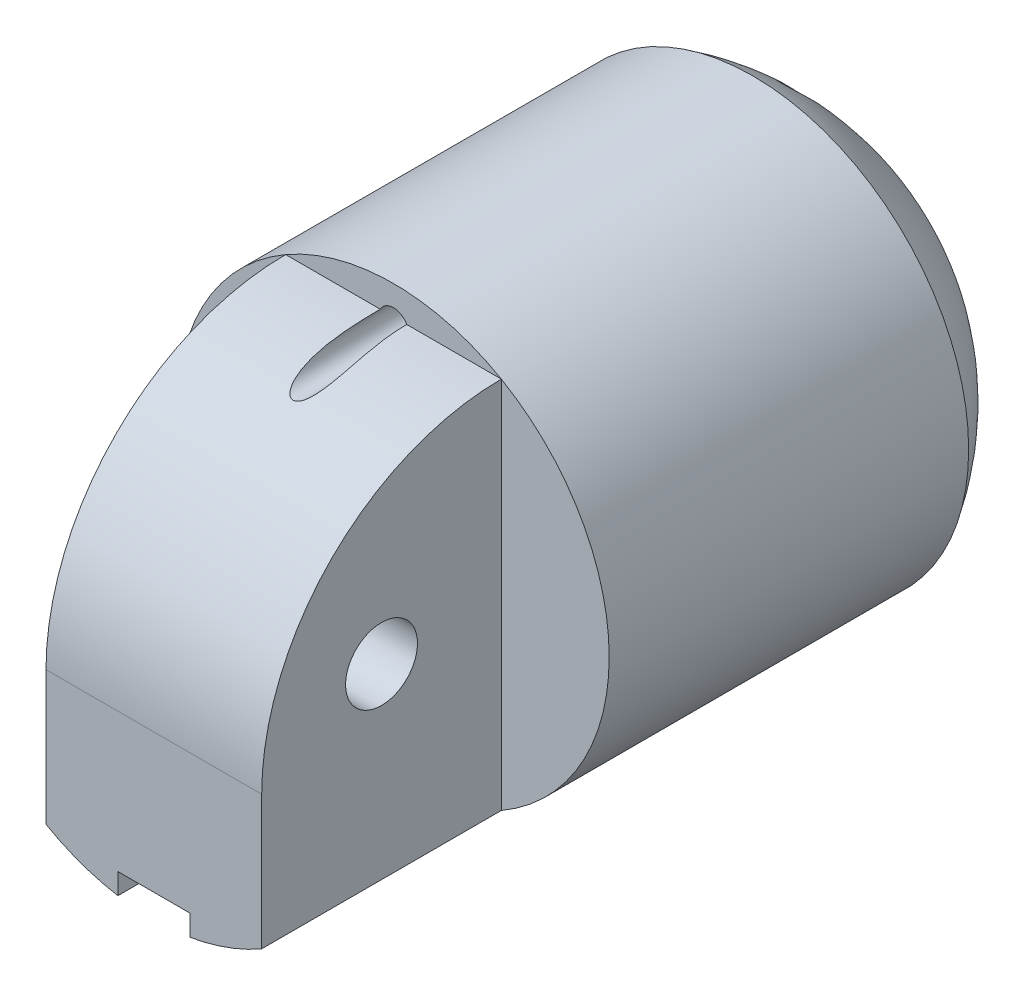
ISO-10303-21;
HEADER;
FILE_DESCRIPTION(('STEP AP214'),'2;1');
FILE_NAME('part.step','',(''),(''),'','','');
FILE_SCHEMA(('AUTOMOTIVE_DESIGN { 1 0 10303 214 1 1 1 1 }'));
ENDSEC;
DATA;
#1=APPLICATION_CONTEXT('core data for automotive mechanical design processes');
#2=APPLICATION_PROTOCOL_DEFINITION('international standard','automotive_design',2000,#1);
#3=PRODUCT_CONTEXT('',#1,'mechanical');
#4=PRODUCT('Part','Part','',(#3));
#5=PRODUCT_RELATED_PRODUCT_CATEGORY('part','',(#4));
#6=PRODUCT_DEFINITION_FORMATION('','',#4);
#7=PRODUCT_DEFINITION_CONTEXT('part definition',#1,'design');
#8=PRODUCT_DEFINITION('design','',#6,#7);
#9=PRODUCT_DEFINITION_SHAPE('','',#8);
#10=(LENGTH_UNIT() NAMED_UNIT(*) SI_UNIT(.MILLI.,.METRE.));
#11=(NAMED_UNIT(*) PLANE_ANGLE_UNIT() SI_UNIT($,.RADIAN.));
#12=(NAMED_UNIT(*) SI_UNIT($,.STERADIAN.) SOLID_ANGLE_UNIT());
#13=UNCERTAINTY_MEASURE_WITH_UNIT(LENGTH_MEASURE(1.E-05),#10,'distance_accuracy_value','');
#14=(GEOMETRIC_REPRESENTATION_CONTEXT(3) GLOBAL_UNCERTAINTY_ASSIGNED_CONTEXT((#13)) GLOBAL_UNIT_ASSIGNED_CONTEXT((#10,
#11,#12)) REPRESENTATION_CONTEXT('',''));
#15=CARTESIAN_POINT('',(0.,0.,0.));
#16=DIRECTION('',(0.,0.,1.));
#17=DIRECTION('',(1.,0.,0.));
#18=AXIS2_PLACEMENT_3D('',#15,#16,#17);
#19=CARTESIAN_POINT('',(0.,0.,0.));
#20=DIRECTION('',(0.,0.,1.));
#21=DIRECTION('',(1.,0.,0.));
#22=AXIS2_PLACEMENT_3D('',#19,#20,#21);
#23=PLANE('',#22);
#24=DIRECTION('',(0.,1.,0.));
#25=VECTOR('',#24,1.);
#26=CARTESIAN_POINT('',(4.5,7.79422863405995,0.));
#27=LINE('',#26,#25);
#28=CARTESIAN_POINT('',(4.5,-7.79422863405995,0.));
#29=VERTEX_POINT('',#28);
#30=CARTESIAN_POINT('',(4.5,7.79422863405995,0.));
#31=VERTEX_POINT('',#30);
#32=EDGE_CURVE('E234',#29,#31,#27,.T.);
#33=ORIENTED_EDGE('',*,*,#32,.F.);
#34=CARTESIAN_POINT('',(0.,0.,0.));
#35=DIRECTION('',(0.,0.,1.));
#36=DIRECTION('',(1.,0.,0.));
#37=AXIS2_PLACEMENT_3D('',#34,#35,#36);
#38=CIRCLE('',#37,9.);
#39=EDGE_CURVE('E210',#29,#31,#38,.T.);
#40=ORIENTED_EDGE('',*,*,#39,.T.);
#41=EDGE_LOOP('',(#33,#40));
#42=FACE_BOUND('',#41,.T.);
#43=ADVANCED_FACE('F43',(#42),#23,.T.);
#44=CARTESIAN_POINT('',(0.,7.5,0.));
#45=DIRECTION('',(0.,0.,1.));
#46=DIRECTION('',(1.,0.,0.));
#47=AXIS2_PLACEMENT_3D('',#44,#45,#46);
#48=CIRCLE('',#47,0.625);
#49=CARTESIAN_POINT('',(0.551411380821265,7.79422863405995,0.));
#50=VERTEX_POINT('',#49);
#51=CARTESIAN_POINT('',(-0.55141138082127,7.79422863405995,0.));
#52=VERTEX_POINT('',#51);
#53=EDGE_CURVE('E67',#50,#52,#48,.T.);
#54=ORIENTED_EDGE('',*,*,#53,.F.);
#55=DIRECTION('',(-1.,0.,0.));
#56=VECTOR('',#55,1.);
#57=CARTESIAN_POINT('',(-4.5,7.79422863405995,0.));
#58=LINE('',#57,#56);
#59=EDGE_CURVE('E241',#31,#50,#58,.T.);
#60=ORIENTED_EDGE('',*,*,#59,.F.);
#61=CARTESIAN_POINT('',(-4.5,7.79422863405995,0.));
#62=VERTEX_POINT('',#61);
#63=EDGE_CURVE('E204',#31,#62,#38,.T.);
#64=ORIENTED_EDGE('',*,*,#63,.T.);
#65=EDGE_CURVE('E245',#52,#62,#58,.T.);
#66=ORIENTED_EDGE('',*,*,#65,.F.);
#67=EDGE_LOOP('',(#54,#60,#64,#66));
#68=FACE_BOUND('',#67,.T.);
#69=ADVANCED_FACE('F279',(#68),#23,.T.);
#70=CARTESIAN_POINT('',(0.,0.,-15.));
#71=DIRECTION('',(0.,0.,1.));
#72=DIRECTION('',(1.,0.,0.));
#73=AXIS2_PLACEMENT_3D('',#70,#71,#72);
#74=CYLINDRICAL_SURFACE('',#73,9.);
#75=DIRECTION('',(0.,0.,1.));
#76=VECTOR('',#75,1.);
#77=CARTESIAN_POINT('',(1.5,-8.87411967464942,-15.));
#78=LINE('',#77,#76);
#79=CARTESIAN_POINT('',(1.5,-8.87411967464942,-10.));
#80=VERTEX_POINT('',#79);
#81=CARTESIAN_POINT('',(1.5,-8.87411967464942,10.));
#82=VERTEX_POINT('',#81);
#83=EDGE_CURVE('E153',#80,#82,#78,.T.);
#84=ORIENTED_EDGE('',*,*,#83,.F.);
#85=CARTESIAN_POINT('',(0.,0.,-10.));
#86=DIRECTION('',(0.,0.,-1.));
#87=DIRECTION('',(-1.,0.,0.));
#88=AXIS2_PLACEMENT_3D('',#85,#86,#87);
#89=CIRCLE('',#88,9.);
#90=CARTESIAN_POINT('',(-1.5,-8.87411967464942,-10.));
#91=VERTEX_POINT('',#90);
#92=EDGE_CURVE('E11',#91,#80,#89,.F.);
#93=ORIENTED_EDGE('',*,*,#92,.F.);
#94=DIRECTION('',(0.,0.,1.));
#95=VECTOR('',#94,1.);
#96=CARTESIAN_POINT('',(-1.5,-8.87411967464942,-15.));
#97=LINE('',#96,#95);
#98=CARTESIAN_POINT('',(-1.5,-8.87411967464942,10.));
#99=VERTEX_POINT('',#98);
#100=EDGE_CURVE('E149',#99,#91,#97,.F.);
#101=ORIENTED_EDGE('',*,*,#100,.F.);
#102=CARTESIAN_POINT('',(0.,0.,10.));
#103=DIRECTION('',(0.,0.,1.));
#104=DIRECTION('',(1.,0.,0.));
#105=AXIS2_PLACEMENT_3D('',#102,#103,#104);
#106=CIRCLE('',#105,9.);
#107=CARTESIAN_POINT('',(-4.5,-7.79422863405995,10.));
#108=VERTEX_POINT('',#107);
#109=EDGE_CURVE('E225',#108,#99,#106,.T.);
#110=ORIENTED_EDGE('',*,*,#109,.F.);
#111=DIRECTION('',(0.,0.,-1.));
#112=VECTOR('',#111,1.);
#113=CARTESIAN_POINT('',(-4.5,-7.79422863405995,10.));
#114=LINE('',#113,#112);
#115=CARTESIAN_POINT('',(-4.5,-7.79422863405995,0.));
#116=VERTEX_POINT('',#115);
#117=EDGE_CURVE('E214',#108,#116,#114,.T.);
#118=ORIENTED_EDGE('',*,*,#117,.T.);
#119=EDGE_CURVE('E208',#62,#116,#38,.T.);
#120=ORIENTED_EDGE('',*,*,#119,.F.);
#121=ORIENTED_EDGE('',*,*,#63,.F.);
#122=ORIENTED_EDGE('',*,*,#39,.F.);
#123=DIRECTION('',(0.,0.,-1.));
#124=VECTOR('',#123,1.);
#125=CARTESIAN_POINT('',(4.49999999999999,-7.79422863405995,10.));
#126=LINE('',#125,#124);
#127=CARTESIAN_POINT('',(4.49999999999999,-7.79422863405995,10.));
#128=VERTEX_POINT('',#127);
#129=EDGE_CURVE('E217',#128,#29,#126,.T.);
#130=ORIENTED_EDGE('',*,*,#129,.F.);
#131=EDGE_CURVE('E229',#82,#128,#106,.T.);
#132=ORIENTED_EDGE('',*,*,#131,.F.);
#133=EDGE_LOOP('',(#84,#93,#101,#110,#118,#120,#121,#122,#130,#132));
#134=FACE_BOUND('',#133,.T.);
#135=CARTESIAN_POINT('',(0.,0.,-15.));
#136=DIRECTION('',(0.,0.,1.));
#137=DIRECTION('',(1.,0.,0.));
#138=AXIS2_PLACEMENT_3D('',#135,#136,#137);
#139=CIRCLE('',#138,9.);
#140=CARTESIAN_POINT('',(9.,0.,-15.));
#141=VERTEX_POINT('',#140);
#142=EDGE_CURVE('E200',#141,#141,#139,.T.);
#143=ORIENTED_EDGE('',*,*,#142,.T.);
#144=EDGE_LOOP('',(#143));
#145=FACE_BOUND('',#144,.T.);
#146=ADVANCED_FACE('F284',(#134,#145),#74,.T.);
#147=CARTESIAN_POINT('',(0.,0.,-9.4));
#148=DIRECTION('',(0.,0.,1.));
#149=DIRECTION('',(1.,0.,0.));
#150=AXIS2_PLACEMENT_3D('',#147,#148,#149);
#151=SPHERICAL_SURFACE('',#150,10.6);
#152=CARTESIAN_POINT('',(-0.426445654390393,7.04308733905155,-17.310313745444));
#153=CARTESIAN_POINT('',(-0.405455872934817,7.02349734626356,-17.3288879947759));
#154=CARTESIAN_POINT('',(-0.382643329551173,7.00490726866983,-17.3464476908468));
#155=CARTESIAN_POINT('',(-0.333334651595282,6.9704583881397,-17.3788947010781));
#156=CARTESIAN_POINT('',(-0.306843239043479,6.95459614140015,-17.3937853858036));
#157=CARTESIAN_POINT('',(-0.254806964160926,6.92867962500003,-17.4180611907755));
#158=CARTESIAN_POINT('',(-0.229754771701625,6.91810585341714,-17.4279422804317));
#159=CARTESIAN_POINT('',(-0.177583226338023,6.90012608263006,-17.4447221507943));
#160=CARTESIAN_POINT('',(-0.150464933709162,6.89271847135509,-17.4516224492088));
#161=CARTESIAN_POINT('',(-0.0946641351525345,6.88155245614212,-17.4620168723288));
#162=CARTESIAN_POINT('',(-0.0659732414970871,6.87781614989446,-17.4654903715286));
#163=CARTESIAN_POINT('',(-0.00814501197001203,6.87438319078459,-17.4686820528607));
#164=CARTESIAN_POINT('',(0.0209921440272409,6.87468495099052,-17.4684017102265));
#165=CARTESIAN_POINT('',(0.0756999462218514,6.87905704078745,-17.4643364474778));
#166=CARTESIAN_POINT('',(0.10133073393438,6.88273903411501,-17.4609126573841));
#167=CARTESIAN_POINT('',(0.15143228197116,6.89308334075946,-17.4512823748074));
#168=CARTESIAN_POINT('',(0.175902940406069,6.89974591531413,-17.4450756384085));
#169=CARTESIAN_POINT('',(0.224099132847224,6.91598244692755,-17.4299251135137));
#170=CARTESIAN_POINT('',(0.247758978667655,6.92565927958657,-17.4208845239541));
#171=CARTESIAN_POINT('',(0.292953530692339,6.94734028404545,-17.4005858546204));
#172=CARTESIAN_POINT('',(0.314487047622596,6.959345747266,-17.3893265443243));
#173=CARTESIAN_POINT('',(0.365247872118878,6.99155975377114,-17.3590391602808));
#174=CARTESIAN_POINT('',(0.39309370626938,7.01291026776738,-17.3389031946588));
#175=CARTESIAN_POINT('',(0.443700439075322,7.05850178336675,-17.2957151612984));
#176=CARTESIAN_POINT('',(0.466449731685933,7.0827491933353,-17.2726566212703));
#177=CARTESIAN_POINT('',(0.514313746418887,7.14217902810627,-17.2158654267094));
#178=CARTESIAN_POINT('',(0.537377134730491,7.17817659049693,-17.1812594074841));
#179=CARTESIAN_POINT('',(0.575228195821594,7.25207839110345,-17.1097008786753));
#180=CARTESIAN_POINT('',(0.590006029318301,7.28998483821947,-17.0727456370483));
#181=CARTESIAN_POINT('',(0.614673926380921,7.37632681324476,-16.987930564498));
#182=CARTESIAN_POINT('',(0.622382135340756,7.42500031038867,-16.9396769210928));
#183=CARTESIAN_POINT('',(0.626500064054548,7.52214839522815,-16.8424136834117));
#184=CARTESIAN_POINT('',(0.622892868106886,7.57062257654755,-16.7934030664466));
#185=CARTESIAN_POINT('',(0.604434773890355,7.6663732284461,-16.6956277381347));
#186=CARTESIAN_POINT('',(0.589504472115293,7.71363879294708,-16.6468672227545));
#187=CARTESIAN_POINT('',(0.547786626602562,7.80507979544524,-16.5516029201188));
#188=CARTESIAN_POINT('',(0.521031721020563,7.84926335436405,-16.5050933093004));
#189=CARTESIAN_POINT('',(0.46843492083198,7.91490643048896,-16.4353710515914));
#190=CARTESIAN_POINT('',(0.446899198211527,7.93813598933121,-16.4105561355756));
#191=CARTESIAN_POINT('',(0.39908150789837,7.9820904231959,-16.3633734350382));
#192=CARTESIAN_POINT('',(0.372806599062086,8.00281894780702,-16.3410020894128));
#193=CARTESIAN_POINT('',(0.321863330634226,8.03640946917344,-16.3045989500477));
#194=CARTESIAN_POINT('',(0.298198956915068,8.04998680650996,-16.2898294840343));
#195=CARTESIAN_POINT('',(0.247961824572211,8.07438342101415,-16.2632208385394));
#196=CARTESIAN_POINT('',(0.221393104462918,8.0852064600362,-16.2513776629449));
#197=CARTESIAN_POINT('',(0.170910087007455,8.10164980195393,-16.2333516071924));
#198=CARTESIAN_POINT('',(0.147421090387886,8.1078633558042,-16.2265256642926));
#199=CARTESIAN_POINT('',(0.0992277741711203,8.1175607911363,-16.215863261228));
#200=CARTESIAN_POINT('',(0.0745243856040015,8.12104673013528,-16.2120245477233));
#201=CARTESIAN_POINT('',(0.0244842899013717,8.12502601595065,-16.2076420275094));
#202=CARTESIAN_POINT('',(-0.000854487749035112,8.12550780048758,-16.2071109511217));
#203=CARTESIAN_POINT('',(-0.0512481227532037,8.12340585468275,-16.2094264345165));
#204=CARTESIAN_POINT('',(-0.076302939546077,8.12082169183719,-16.2122734708391));
#205=CARTESIAN_POINT('',(-0.123981371375414,8.11302920379666,-16.2208469818865));
#206=CARTESIAN_POINT('',(-0.146662452729644,8.10797676757963,-16.2264023665036));
#207=CARTESIAN_POINT('',(-0.190647253094664,8.09565198045805,-16.239929897818));
#208=CARTESIAN_POINT('',(-0.21195040307785,8.08837871944993,-16.2479030353117));
#209=CARTESIAN_POINT('',(-0.261870378077946,8.06837812439516,-16.2697793138773));
#210=CARTESIAN_POINT('',(-0.289620412076191,8.05465589992589,-16.2847517367421));
#211=CARTESIAN_POINT('',(-0.341504583673899,8.02431641563071,-16.3177237854712));
#212=CARTESIAN_POINT('',(-0.365630355823112,8.00769264390398,-16.3357302173004));
#213=CARTESIAN_POINT('',(-0.419769417102238,7.96482594779353,-16.3819565056079));
#214=CARTESIAN_POINT('',(-0.447967245496579,7.93748526002799,-16.4112785369807));
#215=CARTESIAN_POINT('',(-0.497720907498204,7.87993380686961,-16.4725749150024));
#216=CARTESIAN_POINT('',(-0.519265056878305,7.84971811311705,-16.5045538037131));
#217=CARTESIAN_POINT('',(-0.562763232479591,7.77628504970423,-16.5817170481126));
#218=CARTESIAN_POINT('',(-0.582161651450468,7.73225209250228,-16.6275681151241));
#219=CARTESIAN_POINT('',(-0.610447816169607,7.64215765579125,-16.7204629404146));
#220=CARTESIAN_POINT('',(-0.619327609848305,7.5960946688325,-16.7675075736206));
#221=CARTESIAN_POINT('',(-0.626779102192107,7.50248745542258,-16.8621935911409));
#222=CARTESIAN_POINT('',(-0.62521241406062,7.45493168343714,-16.9098346079704));
#223=CARTESIAN_POINT('',(-0.611034884764411,7.36015586156066,-17.0038966887395));
#224=CARTESIAN_POINT('',(-0.598422440301728,7.31293586141022,-17.0503175745689));
#225=CARTESIAN_POINT('',(-0.563754850300231,7.22675100524398,-17.1343153165449));
#226=CARTESIAN_POINT('',(-0.543197912564597,7.18753005472414,-17.1722419286197));
#227=CARTESIAN_POINT('',(-0.492294205261153,7.11228701057638,-17.2445115157128));
#228=CARTESIAN_POINT('',(-0.461982315977163,7.07625409429708,-17.2788666904028));
#229=CARTESIAN_POINT('',(-0.426445654390393,7.04308733905155,-17.310313745444));
#230=B_SPLINE_CURVE_WITH_KNOTS('',3,(#152,#153,#154,#155,#156,#157,#158,#159,#160,#161,#162,
#163,#164,#165,#166,#167,#168,#169,#170,#171,#172,#173,#174,#175,#176,#177,#178,#179,#180,#181,
#182,#183,#184,#185,#186,#187,#188,#189,#190,#191,#192,#193,#194,#195,#196,#197,#198,#199,#200,
#201,#202,#203,#204,#205,#206,#207,#208,#209,#210,#211,#212,#213,#214,#215,#216,#217,#218,#219,
#220,#221,#222,#223,#224,#225,#226,#227,#228,#229),.UNSPECIFIED.,.T.,.F.,(4,2,2,2,2,2,2,2,2,2,2,
2,2,2,2,2,2,2,2,2,2,2,2,2,2,2,2,2,2,2,2,2,2,2,2,2,2,2,4),(0.,0.102477906525493,
0.204825472599015,0.29126796825709,0.377666398584325,0.464581734952706,0.551462915205479,
0.629464007843864,0.707471938351836,0.78850475434381,0.869582638978991,0.990274958688633,
1.11123939136553,1.27535688671529,1.43966886471914,1.64554292895473,1.85172490642899,
2.059366263791,2.2664380364807,2.38682759559063,2.50703929748101,2.59979175468117,
2.69241684118557,2.76781555905777,2.84315734656288,2.91878892869798,2.99443118121757,
3.06581587402896,3.13722985994611,3.23981777885755,3.34263896636589,3.48887610736118,
3.63536860753627,3.83372810761135,4.03223747174607,4.23338170857865,4.43455514645412,
4.6086707219056,4.78217051236434),.UNSPECIFIED.);
#231=CARTESIAN_POINT('',(-0.426445654390393,7.04308733905155,-17.310313745444));
#232=VERTEX_POINT('',#231);
#233=EDGE_CURVE('E158',#232,#232,#230,.T.);
#234=ORIENTED_EDGE('',*,*,#233,.T.);
#235=EDGE_LOOP('',(#234));
#236=FACE_BOUND('',#235,.T.);
#237=ORIENTED_EDGE('',*,*,#142,.F.);
#238=EDGE_LOOP('',(#237));
#239=FACE_BOUND('',#238,.T.);
#240=ADVANCED_FACE('F169',(#236,#239),#151,.T.);
#241=DIRECTION('',(0.,-1.,0.));
#242=VECTOR('',#241,1.);
#243=CARTESIAN_POINT('',(-4.5,7.79422863405995,0.));
#244=LINE('',#243,#242);
#245=EDGE_CURVE('E237',#62,#116,#244,.T.);
#246=ORIENTED_EDGE('',*,*,#245,.F.);
#247=ORIENTED_EDGE('',*,*,#119,.T.);
#248=EDGE_LOOP('',(#246,#247));
#249=FACE_BOUND('',#248,.T.);
#250=ADVANCED_FACE('F265',(#249),#23,.T.);
#251=CARTESIAN_POINT('',(-4.5,7.79422863405995,10.));
#252=DIRECTION('',(1.,0.,0.));
#253=DIRECTION('',(0.,0.,-1.));
#254=AXIS2_PLACEMENT_3D('',#251,#252,#253);
#255=PLANE('',#254);
#256=CARTESIAN_POINT('',(-4.5,0.,5.));
#257=DIRECTION('',(1.,0.,0.));
#258=DIRECTION('',(0.,0.,-1.));
#259=AXIS2_PLACEMENT_3D('',#256,#257,#258);
#260=CIRCLE('',#259,1.5);
#261=CARTESIAN_POINT('',(-4.5,0.,3.5));
#262=VERTEX_POINT('',#261);
#263=EDGE_CURVE('E167',#262,#262,#260,.T.);
#264=ORIENTED_EDGE('',*,*,#263,.T.);
#265=EDGE_LOOP('',(#264));
#266=FACE_BOUND('',#265,.T.);
#267=DIRECTION('',(0.,-1.,0.));
#268=VECTOR('',#267,1.);
#269=CARTESIAN_POINT('',(-4.5,7.79422863405995,10.));
#270=LINE('',#269,#268);
#271=CARTESIAN_POINT('',(-4.5,-2.20577136594005,10.));
#272=VERTEX_POINT('',#271);
#273=EDGE_CURVE('E232',#272,#108,#270,.T.);
#274=ORIENTED_EDGE('',*,*,#273,.F.);
#275=CARTESIAN_POINT('',(-4.5,-2.20577136594005,0.));
#276=DIRECTION('',(1.,0.,0.));
#277=DIRECTION('',(0.,0.,-1.));
#278=AXIS2_PLACEMENT_3D('',#275,#276,#277);
#279=CIRCLE('',#278,10.);
#280=EDGE_CURVE('E194',#272,#62,#279,.F.);
#281=ORIENTED_EDGE('',*,*,#280,.T.);
#282=ORIENTED_EDGE('',*,*,#245,.T.);
#283=ORIENTED_EDGE('',*,*,#117,.F.);
#284=EDGE_LOOP('',(#274,#281,#282,#283));
#285=FACE_BOUND('',#284,.T.);
#286=ADVANCED_FACE('F262',(#266,#285),#255,.F.);
#287=CARTESIAN_POINT('',(4.5,7.79422863405995,10.));
#288=DIRECTION('',(-1.,0.,0.));
#289=DIRECTION('',(0.,0.,1.));
#290=AXIS2_PLACEMENT_3D('',#287,#288,#289);
#291=PLANE('',#290);
#292=CARTESIAN_POINT('',(4.5,0.,5.));
#293=DIRECTION('',(-1.,0.,0.));
#294=DIRECTION('',(0.,0.,1.));
#295=AXIS2_PLACEMENT_3D('',#292,#293,#294);
#296=CIRCLE('',#295,1.5);
#297=CARTESIAN_POINT('',(4.5,0.,6.5));
#298=VERTEX_POINT('',#297);
#299=EDGE_CURVE('E166',#298,#298,#296,.T.);
#300=ORIENTED_EDGE('',*,*,#299,.T.);
#301=EDGE_LOOP('',(#300));
#302=FACE_BOUND('',#301,.T.);
#303=ORIENTED_EDGE('',*,*,#32,.T.);
#304=CARTESIAN_POINT('',(4.5,-2.20577136594005,0.));
#305=DIRECTION('',(-1.,0.,0.));
#306=DIRECTION('',(0.,0.,1.));
#307=AXIS2_PLACEMENT_3D('',#304,#305,#306);
#308=CIRCLE('',#307,10.);
#309=CARTESIAN_POINT('',(4.5,-2.20577136594005,10.));
#310=VERTEX_POINT('',#309);
#311=EDGE_CURVE('E189',#31,#310,#308,.F.);
#312=ORIENTED_EDGE('',*,*,#311,.T.);
#313=DIRECTION('',(0.,1.,0.));
#314=VECTOR('',#313,1.);
#315=CARTESIAN_POINT('',(4.5,7.79422863405995,10.));
#316=LINE('',#315,#314);
#317=EDGE_CURVE('E221',#128,#310,#316,.T.);
#318=ORIENTED_EDGE('',*,*,#317,.F.);
#319=ORIENTED_EDGE('',*,*,#129,.T.);
#320=EDGE_LOOP('',(#303,#312,#318,#319));
#321=FACE_BOUND('',#320,.T.);
#322=ADVANCED_FACE('F254',(#302,#321),#291,.F.);
#323=CARTESIAN_POINT('',(0.,0.,10.));
#324=DIRECTION('',(0.,0.,1.));
#325=DIRECTION('',(1.,0.,0.));
#326=AXIS2_PLACEMENT_3D('',#323,#324,#325);
#327=PLANE('',#326);
#328=DIRECTION('',(0.,1.,0.));
#329=VECTOR('',#328,1.);
#330=CARTESIAN_POINT('',(1.5,0.,10.));
#331=LINE('',#330,#329);
#332=CARTESIAN_POINT('',(1.5,-8.,10.));
#333=VERTEX_POINT('',#332);
#334=EDGE_CURVE('E53',#82,#333,#331,.T.);
#335=ORIENTED_EDGE('',*,*,#334,.F.);
#336=ORIENTED_EDGE('',*,*,#131,.T.);
#337=ORIENTED_EDGE('',*,*,#317,.T.);
#338=DIRECTION('',(-1.,0.,0.));
#339=VECTOR('',#338,1.);
#340=CARTESIAN_POINT('',(-4.5,-2.20577136594005,10.));
#341=LINE('',#340,#339);
#342=EDGE_CURVE('E197',#310,#272,#341,.T.);
#343=ORIENTED_EDGE('',*,*,#342,.T.);
#344=ORIENTED_EDGE('',*,*,#273,.T.);
#345=ORIENTED_EDGE('',*,*,#109,.T.);
#346=DIRECTION('',(0.,-1.,0.));
#347=VECTOR('',#346,1.);
#348=CARTESIAN_POINT('',(-1.5,-10.,10.));
#349=LINE('',#348,#347);
#350=CARTESIAN_POINT('',(-1.5,-8.,10.));
#351=VERTEX_POINT('',#350);
#352=EDGE_CURVE('E125',#351,#99,#349,.T.);
#353=ORIENTED_EDGE('',*,*,#352,.F.);
#354=DIRECTION('',(-1.,0.,0.));
#355=VECTOR('',#354,1.);
#356=CARTESIAN_POINT('',(-1.5,-8.,10.));
#357=LINE('',#356,#355);
#358=EDGE_CURVE('E142',#333,#351,#357,.T.);
#359=ORIENTED_EDGE('',*,*,#358,.F.);
#360=EDGE_LOOP('',(#335,#336,#337,#343,#344,#345,#353,#359));
#361=FACE_BOUND('',#360,.T.);
#362=ADVANCED_FACE('F259',(#361),#327,.T.);
#363=CARTESIAN_POINT('',(-9.,0.,5.));
#364=DIRECTION('',(1.,0.,0.));
#365=DIRECTION('',(0.,0.,-1.));
#366=AXIS2_PLACEMENT_3D('',#363,#364,#365);
#367=CYLINDRICAL_SURFACE('',#366,1.5);
#368=ORIENTED_EDGE('',*,*,#299,.F.);
#369=EDGE_LOOP('',(#368));
#370=FACE_BOUND('',#369,.T.);
#371=ORIENTED_EDGE('',*,*,#263,.F.);
#372=EDGE_LOOP('',(#371));
#373=FACE_BOUND('',#372,.T.);
#374=ADVANCED_FACE('F178',(#370,#373),#367,.F.);
#375=CARTESIAN_POINT('',(0.,-2.20577136594005,0.));
#376=DIRECTION('',(1.,0.,0.));
#377=DIRECTION('',(0.,0.,-1.));
#378=AXIS2_PLACEMENT_3D('',#375,#376,#377);
#379=CYLINDRICAL_SURFACE('',#378,10.);
#380=CARTESIAN_POINT('',(-0.55141138082127,7.79422863405995,0.));
#381=CARTESIAN_POINT('',(-0.551373863101429,7.79422959150468,0.104267225227585));
#382=CARTESIAN_POINT('',(-0.552280963238755,7.79259792899179,0.208529716505634));
#383=CARTESIAN_POINT('',(-0.55570588187607,7.7860774105822,0.416915290686543));
#384=CARTESIAN_POINT('',(-0.55822351899403,7.78118892147352,0.52103838796513));
#385=CARTESIAN_POINT('',(-0.564605529309957,7.7681332980376,0.729509743929233));
#386=CARTESIAN_POINT('',(-0.568475949708644,7.75995141628215,0.833856886899377));
#387=CARTESIAN_POINT('',(-0.577048931137328,7.74032125672933,1.04220475428242));
#388=CARTESIAN_POINT('',(-0.58175148729992,7.72887299803771,1.14620548071799));
#389=CARTESIAN_POINT('',(-0.593847529894315,7.69600313329381,1.40710060274305));
#390=CARTESIAN_POINT('',(-0.601382671858261,7.67247904663428,1.56372880472756));
#391=CARTESIAN_POINT('',(-0.614400373375073,7.61798882791806,1.87586100780043));
#392=CARTESIAN_POINT('',(-0.619881787429108,7.58701855839861,2.0313643341954));
#393=CARTESIAN_POINT('',(-0.625718085045999,7.51777128875946,2.34045027611937));
#394=CARTESIAN_POINT('',(-0.626086998265954,7.47951457697228,2.49403699199215));
#395=CARTESIAN_POINT('',(-0.619784999243952,7.41676944853892,2.72267393980298));
#396=CARTESIAN_POINT('',(-0.616544915787861,7.39497261377851,2.79856032448049));
#397=CARTESIAN_POINT('',(-0.607088687217981,7.34964374501014,2.94961929136679));
#398=CARTESIAN_POINT('',(-0.600873341017374,7.32611217824403,3.02479205967191));
#399=CARTESIAN_POINT('',(-0.586567202109006,7.28334359034256,3.15598311540881));
#400=CARTESIAN_POINT('',(-0.579302589398479,7.26445752996084,3.21220484032374));
#401=CARTESIAN_POINT('',(-0.562045007895569,7.22581149837636,3.32396469399134));
#402=CARTESIAN_POINT('',(-0.552050745678149,7.20605111661177,3.37950248559589));
#403=CARTESIAN_POINT('',(-0.528634364191686,7.16576125430441,3.48967294370354));
#404=CARTESIAN_POINT('',(-0.515207899508812,7.14523082715472,3.54430436861298));
#405=CARTESIAN_POINT('',(-0.483973012371379,7.10367829685238,3.65205141283509));
#406=CARTESIAN_POINT('',(-0.466169541079435,7.08265677336365,3.70516866969636));
#407=CARTESIAN_POINT('',(-0.424494341253102,7.04029241786096,3.80965727499637));
#408=CARTESIAN_POINT('',(-0.400566389565857,7.01894843310331,3.86100715615392));
#409=CARTESIAN_POINT('',(-0.358427186471842,6.98769843182326,3.93456814427629));
#410=CARTESIAN_POINT('',(-0.343395966072833,6.97744018170517,3.95844217796835));
#411=CARTESIAN_POINT('',(-0.310790010508746,6.95741161031191,4.00458538681799));
#412=CARTESIAN_POINT('',(-0.293219961129604,6.94764043380655,4.02685740771007));
#413=CARTESIAN_POINT('',(-0.261345450804056,6.93208802743217,4.06199016231864));
#414=CARTESIAN_POINT('',(-0.247899548535393,6.92606096762379,4.0755166263602));
#415=CARTESIAN_POINT('',(-0.21942819877138,6.91458370403933,4.10113641660192));
#416=CARTESIAN_POINT('',(-0.204401065465146,6.9091341286183,4.11322818339942));
#417=CARTESIAN_POINT('',(-0.172480324448742,6.89903515802145,4.13553499540872));
#418=CARTESIAN_POINT('',(-0.155568533691491,6.89439490850486,4.14572866893104));
#419=CARTESIAN_POINT('',(-0.120060933144785,6.88637237837224,4.16329390757907));
#420=CARTESIAN_POINT('',(-0.101469334801396,6.88298705471203,4.17067230071219));
#421=CARTESIAN_POINT('',(-0.0678092677234222,6.8785186797828,4.18039419518238));
#422=CARTESIAN_POINT('',(-0.0530207826239835,6.87707177103862,4.18353498758026));
#423=CARTESIAN_POINT('',(-0.023072023182805,6.87524642418712,4.18749578695862));
#424=CARTESIAN_POINT('',(-0.00791203586727521,6.87486718590406,4.18831753197226));
#425=CARTESIAN_POINT('',(0.0223407187161936,6.87521609156852,4.18756097098623));
#426=CARTESIAN_POINT('',(0.0374334497411573,6.87594477370288,4.18598149856384));
#427=CARTESIAN_POINT('',(0.0671213783362264,6.87843558570143,4.18057324311852));
#428=CARTESIAN_POINT('',(0.081716165710881,6.88019854682212,4.17674265085228));
#429=CARTESIAN_POINT('',(0.114323077727099,6.88526234198282,4.16571151666745));
#430=CARTESIAN_POINT('',(0.132062106190529,6.88886447627139,4.15784785627243));
#431=CARTESIAN_POINT('',(0.165921292858364,6.89717263284997,4.13962693621841));
#432=CARTESIAN_POINT('',(0.182037959255318,6.90188096638805,4.12926445441067));
#433=CARTESIAN_POINT('',(0.221700190521483,6.91507732912202,4.10006116953361));
#434=CARTESIAN_POINT('',(0.244011695791875,6.92415534982729,4.07982757046402));
#435=CARTESIAN_POINT('',(0.285146017548005,6.94337296439694,4.03654857394381));
#436=CARTESIAN_POINT('',(0.303959658560154,6.95351524405323,4.01349603709871));
#437=CARTESIAN_POINT('',(0.338551410691131,6.97425362745257,3.96583037359684));
#438=CARTESIAN_POINT('',(0.354357988084796,6.98484418061821,3.94123515226884));
#439=CARTESIAN_POINT('',(0.38368828390538,7.00630117023451,3.89081894195123));
#440=CARTESIAN_POINT('',(0.397209688815373,7.01716787361175,3.86499674424073));
#441=CARTESIAN_POINT('',(0.422372797672898,7.03901829530513,3.81243702305508));
#442=CARTESIAN_POINT('',(0.434010640913225,7.05000220597347,3.78569775240745));
#443=CARTESIAN_POINT('',(0.455670172282089,7.07194992987982,3.73158686289398));
#444=CARTESIAN_POINT('',(0.465692531929421,7.08291374958579,3.70421551220638));
#445=CARTESIAN_POINT('',(0.489094132259164,7.11028002893839,3.6349945093874));
#446=CARTESIAN_POINT('',(0.501604612149707,7.12662625929976,3.59282933871186));
#447=CARTESIAN_POINT('',(0.524120175457858,7.15895883401827,3.50769255007734));
#448=CARTESIAN_POINT('',(0.534124042468949,7.17494500023244,3.46472055141257));
#449=CARTESIAN_POINT('',(0.56108198838631,7.22225841796884,3.33477844835733));
#450=CARTESIAN_POINT('',(0.574942060900309,7.25288916269463,3.24691196405124));
#451=CARTESIAN_POINT('',(0.596888405479232,7.31200935239351,3.06931143415838));
#452=CARTESIAN_POINT('',(0.604944790374343,7.34048704672292,2.97957013624911));
#453=CARTESIAN_POINT('',(0.61673396901369,7.3949359108933,2.79915852113313));
#454=CARTESIAN_POINT('',(0.620470935802271,7.42090947772372,2.70848918611849));
#455=CARTESIAN_POINT('',(0.625129633976136,7.47423431966614,2.51186352639113));
#456=CARTESIAN_POINT('',(0.625507020790113,7.50114414254227,2.40577641190136));
#457=CARTESIAN_POINT('',(0.623385434299814,7.5514641762366,2.19279117798168));
#458=CARTESIAN_POINT('',(0.620885810661441,7.57487359445375,2.08589288061487));
#459=CARTESIAN_POINT('',(0.61411524064765,7.61818702593159,1.87131919582866));
#460=CARTESIAN_POINT('',(0.609842227561592,7.63808691049208,1.76364304623818));
#461=CARTESIAN_POINT('',(0.600485013582013,7.67433583115702,1.54772917673171));
#462=CARTESIAN_POINT('',(0.5954007912662,7.69068477346179,1.43949144205851));
#463=CARTESIAN_POINT('',(0.585288299691366,7.71977018471305,1.22291493605605));
#464=CARTESIAN_POINT('',(0.580259896995314,7.73251907698123,1.11457783934654));
#465=CARTESIAN_POINT('',(0.570976117833073,7.754467204629,0.897521338018267));
#466=CARTESIAN_POINT('',(0.566720659086956,7.76366681794687,0.788801975349156));
#467=CARTESIAN_POINT('',(0.559581244356917,7.77849922843766,0.571163465386053));
#468=CARTESIAN_POINT('',(0.556696174514674,7.78413492361837,0.462244552829619));
#469=CARTESIAN_POINT('',(0.552696929117628,7.79183985275399,0.244256585137445));
#470=CARTESIAN_POINT('',(0.551582511091675,7.79390957503265,0.135187552606667));
#471=CARTESIAN_POINT('',(0.55141737522457,7.79421726514818,0.0174144361968645));
#472=CARTESIAN_POINT('',(0.551411294487519,7.7942286379506,0.00870718614020742));
#473=CARTESIAN_POINT('',(0.551411380821266,7.79422863405995,0.));
#474=B_SPLINE_CURVE_WITH_KNOTS('',3,(#380,#381,#382,#383,#384,#385,#386,#387,#388,#389,#390,
#391,#392,#393,#394,#395,#396,#397,#398,#399,#400,#401,#402,#403,#404,#405,#406,#407,#408,#409,
#410,#411,#412,#413,#414,#415,#416,#417,#418,#419,#420,#421,#422,#423,#424,#425,#426,#427,#428,
#429,#430,#431,#432,#433,#434,#435,#436,#437,#438,#439,#440,#441,#442,#443,#444,#445,#446,#447,
#448,#449,#450,#451,#452,#453,#454,#455,#456,#457,#458,#459,#460,#461,#462,#463,#464,#465,#466,
#467,#468,#469,#470,#471,#472,#473),.UNSPECIFIED.,.F.,.F.,(4,2,2,2,2,2,2,2,2,2,2,2,2,2,2,2,2,2,
2,2,2,2,2,2,2,2,2,2,2,2,2,2,2,2,2,2,2,2,2,2,2,2,2,2,2,2,4),(0.,0.31277727575513,
0.625519332082232,0.939677673020743,1.25383417641613,1.7293330407152,2.20509672850185,
2.679554572532,2.91655985120502,3.15350152523644,3.3327002138286,3.51198396220515,
3.69149583065646,3.8708055665033,4.05182442424888,4.14177556979725,4.23156276885918,
4.29147559660324,4.35145295961886,4.41206945040891,4.47253797679019,4.51790204288788,
4.56323210139384,4.60858418660452,4.65397277160085,4.71284741420441,4.77184617855181,
4.86568930339996,4.95977522422129,5.05292055684357,5.14615963246233,5.23958746257771,
5.3329763562134,5.47363733468701,5.61436644134687,5.89625852089338,6.17959207606369,
6.46265166970959,6.79087658420936,7.11917570691421,7.44785850906476,7.77654999245831,
8.10409294058979,8.43160100129526,8.75884240450409,9.08603899176468,9.11216072695035),.UNSPECIFIED.);
#475=EDGE_CURVE('E182',#52,#50,#474,.T.);
#476=ORIENTED_EDGE('',*,*,#475,.F.);
#477=ORIENTED_EDGE('',*,*,#65,.T.);
#478=ORIENTED_EDGE('',*,*,#280,.F.);
#479=ORIENTED_EDGE('',*,*,#342,.F.);
#480=ORIENTED_EDGE('',*,*,#311,.F.);
#481=ORIENTED_EDGE('',*,*,#59,.T.);
#482=EDGE_LOOP('',(#476,#477,#478,#479,#480,#481));
#483=FACE_BOUND('',#482,.T.);
#484=ADVANCED_FACE('F45',(#483),#379,.T.);
#485=CARTESIAN_POINT('',(0.,7.5,-20.));
#486=DIRECTION('',(0.,0.,1.));
#487=DIRECTION('',(1.,0.,0.));
#488=AXIS2_PLACEMENT_3D('',#485,#486,#487);
#489=CYLINDRICAL_SURFACE('',#488,0.625);
#490=ORIENTED_EDGE('',*,*,#53,.T.);
#491=ORIENTED_EDGE('',*,*,#475,.T.);
#492=EDGE_LOOP('',(#490,#491));
#493=FACE_BOUND('',#492,.T.);
#494=ORIENTED_EDGE('',*,*,#233,.F.);
#495=EDGE_LOOP('',(#494));
#496=FACE_BOUND('',#495,.T.);
#497=ADVANCED_FACE('F172',(#493,#496),#489,.F.);
#498=CARTESIAN_POINT('',(1.5,-10.,-10.));
#499=DIRECTION('',(1.,0.,0.));
#500=DIRECTION('',(0.,0.,-1.));
#501=AXIS2_PLACEMENT_3D('',#498,#499,#500);
#502=PLANE('',#501);
#503=ORIENTED_EDGE('',*,*,#83,.T.);
#504=ORIENTED_EDGE('',*,*,#334,.T.);
#505=DIRECTION('',(0.,0.,1.));
#506=VECTOR('',#505,1.);
#507=CARTESIAN_POINT('',(1.5,-8.,-10.));
#508=LINE('',#507,#506);
#509=CARTESIAN_POINT('',(1.5,-8.,-10.));
#510=VERTEX_POINT('',#509);
#511=EDGE_CURVE('E60',#510,#333,#508,.T.);
#512=ORIENTED_EDGE('',*,*,#511,.F.);
#513=DIRECTION('',(0.,1.,0.));
#514=VECTOR('',#513,1.);
#515=CARTESIAN_POINT('',(1.5,-10.,-10.));
#516=LINE('',#515,#514);
#517=EDGE_CURVE('E117',#80,#510,#516,.T.);
#518=ORIENTED_EDGE('',*,*,#517,.F.);
#519=EDGE_LOOP('',(#503,#504,#512,#518));
#520=FACE_BOUND('',#519,.T.);
#521=ADVANCED_FACE('F127',(#520),#502,.F.);
#522=CARTESIAN_POINT('',(-1.5,-10.,-10.));
#523=DIRECTION('',(-1.,0.,0.));
#524=DIRECTION('',(0.,0.,1.));
#525=AXIS2_PLACEMENT_3D('',#522,#523,#524);
#526=PLANE('',#525);
#527=ORIENTED_EDGE('',*,*,#100,.T.);
#528=DIRECTION('',(0.,-1.,0.));
#529=VECTOR('',#528,1.);
#530=CARTESIAN_POINT('',(-1.5,-10.,-10.));
#531=LINE('',#530,#529);
#532=CARTESIAN_POINT('',(-1.5,-8.,-10.));
#533=VERTEX_POINT('',#532);
#534=EDGE_CURVE('E132',#533,#91,#531,.T.);
#535=ORIENTED_EDGE('',*,*,#534,.F.);
#536=DIRECTION('',(0.,0.,1.));
#537=VECTOR('',#536,1.);
#538=CARTESIAN_POINT('',(-1.5,-8.,-10.));
#539=LINE('',#538,#537);
#540=EDGE_CURVE('E131',#533,#351,#539,.T.);
#541=ORIENTED_EDGE('',*,*,#540,.T.);
#542=ORIENTED_EDGE('',*,*,#352,.T.);
#543=EDGE_LOOP('',(#527,#535,#541,#542));
#544=FACE_BOUND('',#543,.T.);
#545=ADVANCED_FACE('F303',(#544),#526,.F.);
#546=CARTESIAN_POINT('',(-1.5,-8.,-10.));
#547=DIRECTION('',(0.,1.,0.));
#548=DIRECTION('',(0.,0.,1.));
#549=AXIS2_PLACEMENT_3D('',#546,#547,#548);
#550=PLANE('',#549);
#551=CARTESIAN_POINT('',(0.,-8.,-7.));
#552=DIRECTION('',(0.,-1.,0.));
#553=DIRECTION('',(0.,0.,-1.));
#554=AXIS2_PLACEMENT_3D('',#551,#552,#553);
#555=CIRCLE('',#554,0.899999999999999);
#556=CARTESIAN_POINT('',(0.,-8.,-7.9));
#557=VERTEX_POINT('',#556);
#558=EDGE_CURVE('E327',#557,#557,#555,.T.);
#559=ORIENTED_EDGE('',*,*,#558,.F.);
#560=EDGE_LOOP('',(#559));
#561=FACE_BOUND('',#560,.T.);
#562=ORIENTED_EDGE('',*,*,#358,.T.);
#563=ORIENTED_EDGE('',*,*,#540,.F.);
#564=DIRECTION('',(-1.,0.,0.));
#565=VECTOR('',#564,1.);
#566=CARTESIAN_POINT('',(-1.5,-8.,-10.));
#567=LINE('',#566,#565);
#568=EDGE_CURVE('E120',#510,#533,#567,.T.);
#569=ORIENTED_EDGE('',*,*,#568,.F.);
#570=ORIENTED_EDGE('',*,*,#511,.T.);
#571=EDGE_LOOP('',(#562,#563,#569,#570));
#572=FACE_BOUND('',#571,.T.);
#573=ADVANCED_FACE('F134',(#561,#572),#550,.F.);
#574=CARTESIAN_POINT('',(0.,0.,-10.));
#575=DIRECTION('',(0.,0.,-1.));
#576=DIRECTION('',(-1.,0.,0.));
#577=AXIS2_PLACEMENT_3D('',#574,#575,#576);
#578=PLANE('',#577);
#579=ORIENTED_EDGE('',*,*,#92,.T.);
#580=ORIENTED_EDGE('',*,*,#517,.T.);
#581=ORIENTED_EDGE('',*,*,#568,.T.);
#582=ORIENTED_EDGE('',*,*,#534,.T.);
#583=EDGE_LOOP('',(#579,#580,#581,#582));
#584=FACE_BOUND('',#583,.T.);
#585=ADVANCED_FACE('F118',(#584),#578,.F.);
#586=CARTESIAN_POINT('',(0.,-3.,-7.));
#587=DIRECTION('',(0.,-1.,0.));
#588=DIRECTION('',(0.,0.,-1.));
#589=AXIS2_PLACEMENT_3D('',#586,#587,#588);
#590=CYLINDRICAL_SURFACE('',#589,0.899999999999999);
#591=CARTESIAN_POINT('',(0.,-3.,-7.));
#592=DIRECTION('',(0.,-1.,0.));
#593=DIRECTION('',(0.,0.,-1.));
#594=AXIS2_PLACEMENT_3D('',#591,#592,#593);
#595=CIRCLE('',#594,0.899999999999999);
#596=CARTESIAN_POINT('',(0.,-3.,-7.9));
#597=VERTEX_POINT('',#596);
#598=EDGE_CURVE('E145',#597,#597,#595,.T.);
#599=ORIENTED_EDGE('',*,*,#598,.F.);
#600=EDGE_LOOP('',(#599));
#601=FACE_BOUND('',#600,.T.);
#602=ORIENTED_EDGE('',*,*,#558,.T.);
#603=EDGE_LOOP('',(#602));
#604=FACE_BOUND('',#603,.T.);
#605=ADVANCED_FACE('F315',(#601,#604),#590,.F.);
#606=CARTESIAN_POINT('',(0.,-3.,-7.));
#607=DIRECTION('',(0.,-1.,0.));
#608=DIRECTION('',(0.,0.,-1.));
#609=AXIS2_PLACEMENT_3D('',#606,#607,#608);
#610=PLANE('',#609);
#611=ORIENTED_EDGE('',*,*,#598,.T.);
#612=EDGE_LOOP('',(#611));
#613=FACE_BOUND('',#612,.T.);
#614=ADVANCED_FACE('F318',(#613),#610,.T.);
#615=CLOSED_SHELL('',(#43,#69,#146,#240,#250,#286,#322,#362,#374,#484,#497,#521,#545,#573,#585,
#605,#614));
#616=MANIFOLD_SOLID_BREP('B2',#615);
#617=ADVANCED_BREP_SHAPE_REPRESENTATION('',(#18,#616),#14);
#618=SHAPE_DEFINITION_REPRESENTATION(#9,#617);
ENDSEC;
END-ISO-10303-21;
